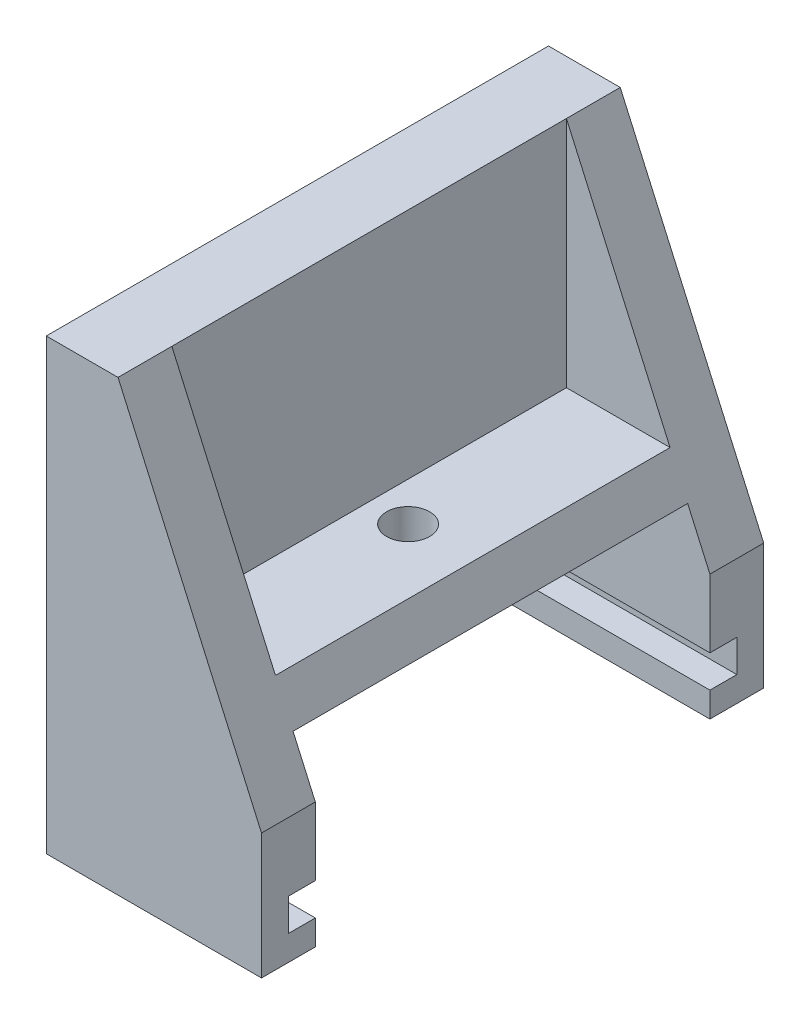
ISO-10303-21;
HEADER;
FILE_DESCRIPTION(('STEP AP214'),'2;1');
FILE_NAME('part.step','',(''),(''),'','','');
FILE_SCHEMA(('AUTOMOTIVE_DESIGN { 1 0 10303 214 1 1 1 1 }'));
ENDSEC;
DATA;
#1=APPLICATION_CONTEXT('core data for automotive mechanical design processes');
#2=APPLICATION_PROTOCOL_DEFINITION('international standard','automotive_design',2000,#1);
#3=PRODUCT_CONTEXT('',#1,'mechanical');
#4=PRODUCT('Part','Part','',(#3));
#5=PRODUCT_RELATED_PRODUCT_CATEGORY('part','',(#4));
#6=PRODUCT_DEFINITION_FORMATION('','',#4);
#7=PRODUCT_DEFINITION_CONTEXT('part definition',#1,'design');
#8=PRODUCT_DEFINITION('design','',#6,#7);
#9=PRODUCT_DEFINITION_SHAPE('','',#8);
#10=(LENGTH_UNIT() NAMED_UNIT(*) SI_UNIT(.MILLI.,.METRE.));
#11=(NAMED_UNIT(*) PLANE_ANGLE_UNIT() SI_UNIT($,.RADIAN.));
#12=(NAMED_UNIT(*) SI_UNIT($,.STERADIAN.) SOLID_ANGLE_UNIT());
#13=UNCERTAINTY_MEASURE_WITH_UNIT(LENGTH_MEASURE(1.E-05),#10,'distance_accuracy_value','');
#14=(GEOMETRIC_REPRESENTATION_CONTEXT(3) GLOBAL_UNCERTAINTY_ASSIGNED_CONTEXT((#13)) GLOBAL_UNIT_ASSIGNED_CONTEXT((#10,
#11,#12)) REPRESENTATION_CONTEXT('',''));
#15=CARTESIAN_POINT('',(0.,0.,0.));
#16=DIRECTION('',(0.,0.,1.));
#17=DIRECTION('',(1.,0.,0.));
#18=AXIS2_PLACEMENT_3D('',#15,#16,#17);
#19=CARTESIAN_POINT('',(12.,-25.,-28.));
#20=DIRECTION('',(1.,0.,0.));
#21=DIRECTION('',(0.,0.,-1.));
#22=AXIS2_PLACEMENT_3D('',#19,#20,#21);
#23=PLANE('',#22);
#24=DIRECTION('',(0.,-1.,0.));
#25=VECTOR('',#24,1.);
#26=CARTESIAN_POINT('',(12.,-25.,-26.5));
#27=LINE('',#26,#25);
#28=CARTESIAN_POINT('',(12.,-21.8,-26.5));
#29=VERTEX_POINT('',#28);
#30=CARTESIAN_POINT('',(12.,-23.6,-26.5));
#31=VERTEX_POINT('',#30);
#32=EDGE_CURVE('E357',#29,#31,#27,.T.);
#33=ORIENTED_EDGE('',*,*,#32,.T.);
#34=DIRECTION('',(0.,0.,1.));
#35=VECTOR('',#34,1.);
#36=CARTESIAN_POINT('',(12.,-23.6,-28.));
#37=LINE('',#36,#35);
#38=CARTESIAN_POINT('',(12.,-23.6,-25.));
#39=VERTEX_POINT('',#38);
#40=EDGE_CURVE('E360',#31,#39,#37,.T.);
#41=ORIENTED_EDGE('',*,*,#40,.T.);
#42=DIRECTION('',(0.,1.,0.));
#43=VECTOR('',#42,1.);
#44=CARTESIAN_POINT('',(12.,-25.,-25.));
#45=LINE('',#44,#43);
#46=CARTESIAN_POINT('',(12.,-25.,-25.));
#47=VERTEX_POINT('',#46);
#48=EDGE_CURVE('E278',#47,#39,#45,.T.);
#49=ORIENTED_EDGE('',*,*,#48,.F.);
#50=DIRECTION('',(0.,0.,1.));
#51=VECTOR('',#50,1.);
#52=CARTESIAN_POINT('',(12.,-25.,-28.));
#53=LINE('',#52,#51);
#54=CARTESIAN_POINT('',(12.,-25.,-28.));
#55=VERTEX_POINT('',#54);
#56=EDGE_CURVE('E220',#55,#47,#53,.T.);
#57=ORIENTED_EDGE('',*,*,#56,.F.);
#58=DIRECTION('',(0.,1.,0.));
#59=VECTOR('',#58,1.);
#60=CARTESIAN_POINT('',(12.,-25.,-28.));
#61=LINE('',#60,#59);
#62=CARTESIAN_POINT('',(12.,-18.,-28.));
#63=VERTEX_POINT('',#62);
#64=EDGE_CURVE('E292',#55,#63,#61,.T.);
#65=ORIENTED_EDGE('',*,*,#64,.T.);
#66=DIRECTION('',(0.,0.,1.));
#67=VECTOR('',#66,1.);
#68=CARTESIAN_POINT('',(12.,-18.,-28.));
#69=LINE('',#68,#67);
#70=CARTESIAN_POINT('',(12.,-18.,-25.));
#71=VERTEX_POINT('',#70);
#72=EDGE_CURVE('E212',#63,#71,#69,.T.);
#73=ORIENTED_EDGE('',*,*,#72,.T.);
#74=CARTESIAN_POINT('',(12.,-21.8,-25.));
#75=VERTEX_POINT('',#74);
#76=EDGE_CURVE('E277',#75,#71,#45,.T.);
#77=ORIENTED_EDGE('',*,*,#76,.F.);
#78=DIRECTION('',(0.,0.,-1.));
#79=VECTOR('',#78,1.);
#80=CARTESIAN_POINT('',(12.,-21.8,-28.));
#81=LINE('',#80,#79);
#82=EDGE_CURVE('E56',#75,#29,#81,.T.);
#83=ORIENTED_EDGE('',*,*,#82,.T.);
#84=EDGE_LOOP('',(#33,#41,#49,#57,#65,#73,#77,#83));
#85=FACE_BOUND('',#84,.T.);
#86=ADVANCED_FACE('F33',(#85),#23,.T.);
#87=CARTESIAN_POINT('',(0.,0.,-28.));
#88=DIRECTION('',(-1.,0.,0.));
#89=DIRECTION('',(0.,0.,1.));
#90=AXIS2_PLACEMENT_3D('',#87,#88,#89);
#91=PLANE('',#90);
#92=DIRECTION('',(0.,-1.,0.));
#93=VECTOR('',#92,1.);
#94=CARTESIAN_POINT('',(0.,-15.2079971845944,-25.));
#95=LINE('',#94,#93);
#96=CARTESIAN_POINT('',(0.,-23.6,-25.));
#97=VERTEX_POINT('',#96);
#98=CARTESIAN_POINT('',(0.,-25.,-25.));
#99=VERTEX_POINT('',#98);
#100=EDGE_CURVE('E254',#97,#99,#95,.T.);
#101=ORIENTED_EDGE('',*,*,#100,.F.);
#102=DIRECTION('',(0.,0.,-1.));
#103=VECTOR('',#102,1.);
#104=CARTESIAN_POINT('',(0.,-23.6,-25.));
#105=LINE('',#104,#103);
#106=CARTESIAN_POINT('',(0.,-23.6,-26.5));
#107=VERTEX_POINT('',#106);
#108=EDGE_CURVE('E367',#97,#107,#105,.T.);
#109=ORIENTED_EDGE('',*,*,#108,.T.);
#110=DIRECTION('',(0.,1.,0.));
#111=VECTOR('',#110,1.);
#112=CARTESIAN_POINT('',(0.,-21.8,-26.5));
#113=LINE('',#112,#111);
#114=CARTESIAN_POINT('',(0.,-21.8,-26.5));
#115=VERTEX_POINT('',#114);
#116=EDGE_CURVE('E246',#107,#115,#113,.T.);
#117=ORIENTED_EDGE('',*,*,#116,.T.);
#118=DIRECTION('',(0.,0.,1.));
#119=VECTOR('',#118,1.);
#120=CARTESIAN_POINT('',(0.,-21.8,-25.));
#121=LINE('',#120,#119);
#122=CARTESIAN_POINT('',(0.,-21.8,-25.));
#123=VERTEX_POINT('',#122);
#124=EDGE_CURVE('E233',#115,#123,#121,.T.);
#125=ORIENTED_EDGE('',*,*,#124,.T.);
#126=CARTESIAN_POINT('',(0.,-15.2079971845944,-25.));
#127=VERTEX_POINT('',#126);
#128=EDGE_CURVE('E243',#127,#123,#95,.T.);
#129=ORIENTED_EDGE('',*,*,#128,.F.);
#130=DIRECTION('',(0.,0.,1.));
#131=VECTOR('',#130,1.);
#132=CARTESIAN_POINT('',(0.,-15.2079971845944,-25.));
#133=LINE('',#132,#131);
#134=CARTESIAN_POINT('',(0.,-15.2079971845944,-3.));
#135=VERTEX_POINT('',#134);
#136=EDGE_CURVE('E257',#127,#135,#133,.T.);
#137=ORIENTED_EDGE('',*,*,#136,.T.);
#138=DIRECTION('',(0.,-1.,0.));
#139=VECTOR('',#138,1.);
#140=CARTESIAN_POINT('',(0.,-15.2079971845944,-3.));
#141=LINE('',#140,#139);
#142=CARTESIAN_POINT('',(0.,-21.8,-3.));
#143=VERTEX_POINT('',#142);
#144=EDGE_CURVE('E336',#135,#143,#141,.T.);
#145=ORIENTED_EDGE('',*,*,#144,.T.);
#146=DIRECTION('',(0.,0.,-1.));
#147=VECTOR('',#146,1.);
#148=CARTESIAN_POINT('',(0.,-21.8,-3.));
#149=LINE('',#148,#147);
#150=CARTESIAN_POINT('',(0.,-21.8,-1.5));
#151=VERTEX_POINT('',#150);
#152=EDGE_CURVE('E348',#151,#143,#149,.T.);
#153=ORIENTED_EDGE('',*,*,#152,.F.);
#154=DIRECTION('',(0.,1.,0.));
#155=VECTOR('',#154,1.);
#156=CARTESIAN_POINT('',(0.,-21.8,-1.5));
#157=LINE('',#156,#155);
#158=CARTESIAN_POINT('',(0.,-23.6,-1.5));
#159=VERTEX_POINT('',#158);
#160=EDGE_CURVE('E351',#159,#151,#157,.T.);
#161=ORIENTED_EDGE('',*,*,#160,.F.);
#162=DIRECTION('',(0.,0.,1.));
#163=VECTOR('',#162,1.);
#164=CARTESIAN_POINT('',(0.,-23.6,-3.));
#165=LINE('',#164,#163);
#166=CARTESIAN_POINT('',(0.,-23.6,-3.));
#167=VERTEX_POINT('',#166);
#168=EDGE_CURVE('E354',#167,#159,#165,.T.);
#169=ORIENTED_EDGE('',*,*,#168,.F.);
#170=CARTESIAN_POINT('',(0.,-25.,-3.));
#171=VERTEX_POINT('',#170);
#172=EDGE_CURVE('E337',#167,#171,#141,.T.);
#173=ORIENTED_EDGE('',*,*,#172,.T.);
#174=DIRECTION('',(0.,0.,1.));
#175=VECTOR('',#174,1.);
#176=CARTESIAN_POINT('',(0.,-25.,-28.));
#177=LINE('',#176,#175);
#178=CARTESIAN_POINT('',(0.,-25.,0.));
#179=VERTEX_POINT('',#178);
#180=EDGE_CURVE('E227',#171,#179,#177,.T.);
#181=ORIENTED_EDGE('',*,*,#180,.T.);
#182=DIRECTION('',(0.,-1.,0.));
#183=VECTOR('',#182,1.);
#184=CARTESIAN_POINT('',(0.,0.,0.));
#185=LINE('',#184,#183);
#186=CARTESIAN_POINT('',(0.,0.,0.));
#187=VERTEX_POINT('',#186);
#188=EDGE_CURVE('E298',#187,#179,#185,.T.);
#189=ORIENTED_EDGE('',*,*,#188,.F.);
#190=DIRECTION('',(0.,0.,1.));
#191=VECTOR('',#190,1.);
#192=CARTESIAN_POINT('',(0.,0.,-28.));
#193=LINE('',#192,#191);
#194=CARTESIAN_POINT('',(0.,0.,-28.));
#195=VERTEX_POINT('',#194);
#196=EDGE_CURVE('E228',#195,#187,#193,.T.);
#197=ORIENTED_EDGE('',*,*,#196,.F.);
#198=DIRECTION('',(0.,-1.,0.));
#199=VECTOR('',#198,1.);
#200=CARTESIAN_POINT('',(0.,0.,-28.));
#201=LINE('',#200,#199);
#202=CARTESIAN_POINT('',(0.,-25.,-28.));
#203=VERTEX_POINT('',#202);
#204=EDGE_CURVE('E286',#195,#203,#201,.T.);
#205=ORIENTED_EDGE('',*,*,#204,.T.);
#206=EDGE_CURVE('E224',#203,#99,#177,.T.);
#207=ORIENTED_EDGE('',*,*,#206,.T.);
#208=EDGE_LOOP('',(#101,#109,#117,#125,#129,#137,#145,#153,#161,#169,#173,#181,#189,#197,#205,#207));
#209=FACE_BOUND('',#208,.T.);
#210=ADVANCED_FACE('F241',(#209),#91,.T.);
#211=CARTESIAN_POINT('',(15.,-15.2079971845944,-25.));
#212=DIRECTION('',(0.,0.,-1.));
#213=DIRECTION('',(0.,1.,0.));
#214=AXIS2_PLACEMENT_3D('',#211,#212,#213);
#215=PLANE('',#214);
#216=DIRECTION('',(1.,0.,0.));
#217=VECTOR('',#216,1.);
#218=CARTESIAN_POINT('',(15.,-23.6,-25.));
#219=LINE('',#218,#217);
#220=EDGE_CURVE('E11',#97,#39,#219,.T.);
#221=ORIENTED_EDGE('',*,*,#220,.F.);
#222=ORIENTED_EDGE('',*,*,#100,.T.);
#223=DIRECTION('',(1.,0.,0.));
#224=VECTOR('',#223,1.);
#225=CARTESIAN_POINT('',(0.,-25.,-25.));
#226=LINE('',#225,#224);
#227=EDGE_CURVE('E275',#99,#47,#226,.T.);
#228=ORIENTED_EDGE('',*,*,#227,.T.);
#229=ORIENTED_EDGE('',*,*,#48,.T.);
#230=EDGE_LOOP('',(#221,#222,#228,#229));
#231=FACE_BOUND('',#230,.T.);
#232=ADVANCED_FACE('F407',(#231),#215,.F.);
#233=DIRECTION('',(-1.,0.,0.));
#234=VECTOR('',#233,1.);
#235=CARTESIAN_POINT('',(15.,-21.8,-25.));
#236=LINE('',#235,#234);
#237=EDGE_CURVE('E41',#75,#123,#236,.T.);
#238=ORIENTED_EDGE('',*,*,#237,.F.);
#239=ORIENTED_EDGE('',*,*,#76,.T.);
#240=DIRECTION('',(-0.406138466053448,0.913811548620257,0.));
#241=VECTOR('',#240,1.);
#242=CARTESIAN_POINT('',(12.,-18.,-25.));
#243=LINE('',#242,#241);
#244=CARTESIAN_POINT('',(10.7591098598198,-15.2079971845944,-25.));
#245=VERTEX_POINT('',#244);
#246=EDGE_CURVE('E281',#71,#245,#243,.T.);
#247=ORIENTED_EDGE('',*,*,#246,.T.);
#248=DIRECTION('',(-1.,0.,0.));
#249=VECTOR('',#248,1.);
#250=CARTESIAN_POINT('',(15.,-15.2079971845944,-25.));
#251=LINE('',#250,#249);
#252=EDGE_CURVE('E251',#245,#127,#251,.T.);
#253=ORIENTED_EDGE('',*,*,#252,.T.);
#254=ORIENTED_EDGE('',*,*,#128,.T.);
#255=EDGE_LOOP('',(#238,#239,#247,#253,#254));
#256=FACE_BOUND('',#255,.T.);
#257=ADVANCED_FACE('F249',(#256),#215,.F.);
#258=CARTESIAN_POINT('',(15.,-15.2079971845944,-3.));
#259=DIRECTION('',(0.,0.,-1.));
#260=DIRECTION('',(-1.,0.,0.));
#261=AXIS2_PLACEMENT_3D('',#258,#259,#260);
#262=PLANE('',#261);
#263=DIRECTION('',(1.,0.,0.));
#264=VECTOR('',#263,1.);
#265=CARTESIAN_POINT('',(15.,-21.8,-3.));
#266=LINE('',#265,#264);
#267=CARTESIAN_POINT('',(12.,-21.8,-3.));
#268=VERTEX_POINT('',#267);
#269=EDGE_CURVE('E210',#143,#268,#266,.T.);
#270=ORIENTED_EDGE('',*,*,#269,.F.);
#271=ORIENTED_EDGE('',*,*,#144,.F.);
#272=DIRECTION('',(-1.,0.,0.));
#273=VECTOR('',#272,1.);
#274=CARTESIAN_POINT('',(15.,-15.2079971845944,-3.));
#275=LINE('',#274,#273);
#276=CARTESIAN_POINT('',(10.7591098598198,-15.2079971845944,-3.));
#277=VERTEX_POINT('',#276);
#278=EDGE_CURVE('E253',#277,#135,#275,.T.);
#279=ORIENTED_EDGE('',*,*,#278,.F.);
#280=DIRECTION('',(-0.406138466053448,0.913811548620257,0.));
#281=VECTOR('',#280,1.);
#282=CARTESIAN_POINT('',(12.,-18.,-3.));
#283=LINE('',#282,#281);
#284=CARTESIAN_POINT('',(12.,-18.,-3.));
#285=VERTEX_POINT('',#284);
#286=EDGE_CURVE('E269',#285,#277,#283,.T.);
#287=ORIENTED_EDGE('',*,*,#286,.F.);
#288=DIRECTION('',(0.,1.,0.));
#289=VECTOR('',#288,1.);
#290=CARTESIAN_POINT('',(12.,-25.,-3.));
#291=LINE('',#290,#289);
#292=EDGE_CURVE('E265',#268,#285,#291,.T.);
#293=ORIENTED_EDGE('',*,*,#292,.F.);
#294=EDGE_LOOP('',(#270,#271,#279,#287,#293));
#295=FACE_BOUND('',#294,.T.);
#296=ADVANCED_FACE('F330',(#295),#262,.T.);
#297=DIRECTION('',(0.,0.,1.));
#298=VECTOR('',#297,1.);
#299=CARTESIAN_POINT('',(12.,-21.8,-28.));
#300=LINE('',#299,#298);
#301=CARTESIAN_POINT('',(12.,-21.8,-1.5));
#302=VERTEX_POINT('',#301);
#303=EDGE_CURVE('E326',#268,#302,#300,.T.);
#304=ORIENTED_EDGE('',*,*,#303,.F.);
#305=ORIENTED_EDGE('',*,*,#292,.T.);
#306=CARTESIAN_POINT('',(12.,-18.,0.));
#307=VERTEX_POINT('',#306);
#308=EDGE_CURVE('E219',#285,#307,#69,.T.);
#309=ORIENTED_EDGE('',*,*,#308,.T.);
#310=DIRECTION('',(0.,1.,0.));
#311=VECTOR('',#310,1.);
#312=CARTESIAN_POINT('',(12.,-25.,0.));
#313=LINE('',#312,#311);
#314=CARTESIAN_POINT('',(12.,-25.,0.));
#315=VERTEX_POINT('',#314);
#316=EDGE_CURVE('E303',#315,#307,#313,.T.);
#317=ORIENTED_EDGE('',*,*,#316,.F.);
#318=CARTESIAN_POINT('',(12.,-25.,-3.));
#319=VERTEX_POINT('',#318);
#320=EDGE_CURVE('E223',#319,#315,#53,.T.);
#321=ORIENTED_EDGE('',*,*,#320,.F.);
#322=CARTESIAN_POINT('',(12.,-23.6,-3.));
#323=VERTEX_POINT('',#322);
#324=EDGE_CURVE('E266',#319,#323,#291,.T.);
#325=ORIENTED_EDGE('',*,*,#324,.T.);
#326=DIRECTION('',(0.,0.,-1.));
#327=VECTOR('',#326,1.);
#328=CARTESIAN_POINT('',(12.,-23.6,-28.));
#329=LINE('',#328,#327);
#330=CARTESIAN_POINT('',(12.,-23.6,-1.5));
#331=VERTEX_POINT('',#330);
#332=EDGE_CURVE('E343',#331,#323,#329,.T.);
#333=ORIENTED_EDGE('',*,*,#332,.F.);
#334=DIRECTION('',(0.,-1.,0.));
#335=VECTOR('',#334,1.);
#336=CARTESIAN_POINT('',(12.,-25.,-1.5));
#337=LINE('',#336,#335);
#338=EDGE_CURVE('E339',#302,#331,#337,.T.);
#339=ORIENTED_EDGE('',*,*,#338,.F.);
#340=EDGE_LOOP('',(#304,#305,#309,#317,#321,#325,#333,#339));
#341=FACE_BOUND('',#340,.T.);
#342=ADVANCED_FACE('F322',(#341),#23,.T.);
#343=CARTESIAN_POINT('',(0.,-25.,-28.));
#344=DIRECTION('',(0.,-1.,0.));
#345=DIRECTION('',(0.,0.,-1.));
#346=AXIS2_PLACEMENT_3D('',#343,#344,#345);
#347=PLANE('',#346);
#348=ORIENTED_EDGE('',*,*,#180,.F.);
#349=DIRECTION('',(1.,0.,0.));
#350=VECTOR('',#349,1.);
#351=CARTESIAN_POINT('',(0.,-25.,-3.));
#352=LINE('',#351,#350);
#353=EDGE_CURVE('E261',#171,#319,#352,.T.);
#354=ORIENTED_EDGE('',*,*,#353,.T.);
#355=ORIENTED_EDGE('',*,*,#320,.T.);
#356=DIRECTION('',(1.,0.,0.));
#357=VECTOR('',#356,1.);
#358=CARTESIAN_POINT('',(0.,-25.,0.));
#359=LINE('',#358,#357);
#360=EDGE_CURVE('E301',#179,#315,#359,.T.);
#361=ORIENTED_EDGE('',*,*,#360,.F.);
#362=EDGE_LOOP('',(#348,#354,#355,#361));
#363=FACE_BOUND('',#362,.T.);
#364=ADVANCED_FACE('F317',(#363),#347,.T.);
#365=CARTESIAN_POINT('',(4.,0.,-28.));
#366=DIRECTION('',(0.,1.,0.));
#367=DIRECTION('',(-1.,0.,0.));
#368=AXIS2_PLACEMENT_3D('',#365,#366,#367);
#369=PLANE('',#368);
#370=DIRECTION('',(-1.,0.,0.));
#371=VECTOR('',#370,1.);
#372=CARTESIAN_POINT('',(4.,0.,0.));
#373=LINE('',#372,#371);
#374=CARTESIAN_POINT('',(4.,0.,0.));
#375=VERTEX_POINT('',#374);
#376=EDGE_CURVE('E283',#375,#187,#373,.T.);
#377=ORIENTED_EDGE('',*,*,#376,.F.);
#378=DIRECTION('',(0.,0.,1.));
#379=VECTOR('',#378,1.);
#380=CARTESIAN_POINT('',(4.,0.,-28.));
#381=LINE('',#380,#379);
#382=CARTESIAN_POINT('',(4.,0.,-3.));
#383=VERTEX_POINT('',#382);
#384=EDGE_CURVE('E202',#383,#375,#381,.T.);
#385=ORIENTED_EDGE('',*,*,#384,.F.);
#386=DIRECTION('',(0.,0.,1.));
#387=VECTOR('',#386,1.);
#388=CARTESIAN_POINT('',(4.,0.,-25.));
#389=LINE('',#388,#387);
#390=CARTESIAN_POINT('',(4.,0.,-25.));
#391=VERTEX_POINT('',#390);
#392=EDGE_CURVE('E180',#391,#383,#389,.T.);
#393=ORIENTED_EDGE('',*,*,#392,.F.);
#394=CARTESIAN_POINT('',(4.,0.,-28.));
#395=VERTEX_POINT('',#394);
#396=EDGE_CURVE('E200',#395,#391,#381,.T.);
#397=ORIENTED_EDGE('',*,*,#396,.F.);
#398=DIRECTION('',(-1.,0.,0.));
#399=VECTOR('',#398,1.);
#400=CARTESIAN_POINT('',(4.,0.,-28.));
#401=LINE('',#400,#399);
#402=EDGE_CURVE('E284',#395,#195,#401,.T.);
#403=ORIENTED_EDGE('',*,*,#402,.T.);
#404=ORIENTED_EDGE('',*,*,#196,.T.);
#405=EDGE_LOOP('',(#377,#385,#393,#397,#403,#404));
#406=FACE_BOUND('',#405,.T.);
#407=ADVANCED_FACE('F35',(#406),#369,.T.);
#408=CARTESIAN_POINT('',(12.,-18.,-28.));
#409=DIRECTION('',(0.913811548620257,0.406138466053448,0.));
#410=DIRECTION('',(-0.406138466053448,0.913811548620257,0.));
#411=AXIS2_PLACEMENT_3D('',#408,#409,#410);
#412=PLANE('',#411);
#413=DIRECTION('',(-0.406138466053448,0.913811548620257,0.));
#414=VECTOR('',#413,1.);
#415=CARTESIAN_POINT('',(9.77777777777778,-13.,-25.));
#416=LINE('',#415,#414);
#417=CARTESIAN_POINT('',(9.77777777777778,-13.,-25.));
#418=VERTEX_POINT('',#417);
#419=EDGE_CURVE('E187',#418,#391,#416,.T.);
#420=ORIENTED_EDGE('',*,*,#419,.F.);
#421=DIRECTION('',(0.,0.,1.));
#422=VECTOR('',#421,1.);
#423=CARTESIAN_POINT('',(9.77777777777778,-13.,-25.));
#424=LINE('',#423,#422);
#425=CARTESIAN_POINT('',(9.77777777777778,-13.,-3.));
#426=VERTEX_POINT('',#425);
#427=EDGE_CURVE('E247',#418,#426,#424,.T.);
#428=ORIENTED_EDGE('',*,*,#427,.T.);
#429=DIRECTION('',(-0.406138466053448,0.913811548620257,0.));
#430=VECTOR('',#429,1.);
#431=CARTESIAN_POINT('',(9.77777777777778,-13.,-3.));
#432=LINE('',#431,#430);
#433=EDGE_CURVE('E311',#426,#383,#432,.T.);
#434=ORIENTED_EDGE('',*,*,#433,.T.);
#435=ORIENTED_EDGE('',*,*,#384,.T.);
#436=DIRECTION('',(-0.406138466053448,0.913811548620257,0.));
#437=VECTOR('',#436,1.);
#438=CARTESIAN_POINT('',(12.,-18.,0.));
#439=LINE('',#438,#437);
#440=EDGE_CURVE('E215',#307,#375,#439,.T.);
#441=ORIENTED_EDGE('',*,*,#440,.F.);
#442=ORIENTED_EDGE('',*,*,#308,.F.);
#443=ORIENTED_EDGE('',*,*,#286,.T.);
#444=DIRECTION('',(0.,0.,-1.));
#445=VECTOR('',#444,1.);
#446=CARTESIAN_POINT('',(10.7591098598198,-15.2079971845944,-28.));
#447=LINE('',#446,#445);
#448=EDGE_CURVE('E272',#277,#245,#447,.T.);
#449=ORIENTED_EDGE('',*,*,#448,.T.);
#450=ORIENTED_EDGE('',*,*,#246,.F.);
#451=ORIENTED_EDGE('',*,*,#72,.F.);
#452=DIRECTION('',(-0.406138466053448,0.913811548620257,0.));
#453=VECTOR('',#452,1.);
#454=CARTESIAN_POINT('',(12.,-18.,-28.));
#455=LINE('',#454,#453);
#456=EDGE_CURVE('E207',#63,#395,#455,.T.);
#457=ORIENTED_EDGE('',*,*,#456,.T.);
#458=ORIENTED_EDGE('',*,*,#396,.T.);
#459=EDGE_LOOP('',(#420,#428,#434,#435,#441,#442,#443,#449,#450,#451,#457,#458));
#460=FACE_BOUND('',#459,.T.);
#461=ADVANCED_FACE('F205',(#460),#412,.T.);
#462=ORIENTED_EDGE('',*,*,#227,.F.);
#463=ORIENTED_EDGE('',*,*,#206,.F.);
#464=DIRECTION('',(1.,0.,0.));
#465=VECTOR('',#464,1.);
#466=CARTESIAN_POINT('',(0.,-25.,-28.));
#467=LINE('',#466,#465);
#468=EDGE_CURVE('E289',#203,#55,#467,.T.);
#469=ORIENTED_EDGE('',*,*,#468,.T.);
#470=ORIENTED_EDGE('',*,*,#56,.T.);
#471=EDGE_LOOP('',(#462,#463,#469,#470));
#472=FACE_BOUND('',#471,.T.);
#473=ADVANCED_FACE('F415',(#472),#347,.T.);
#474=CARTESIAN_POINT('',(0.,0.,-28.));
#475=DIRECTION('',(0.,0.,1.));
#476=DIRECTION('',(1.,0.,0.));
#477=AXIS2_PLACEMENT_3D('',#474,#475,#476);
#478=PLANE('',#477);
#479=ORIENTED_EDGE('',*,*,#402,.F.);
#480=ORIENTED_EDGE('',*,*,#456,.F.);
#481=ORIENTED_EDGE('',*,*,#64,.F.);
#482=ORIENTED_EDGE('',*,*,#468,.F.);
#483=ORIENTED_EDGE('',*,*,#204,.F.);
#484=EDGE_LOOP('',(#479,#480,#481,#482,#483));
#485=FACE_BOUND('',#484,.T.);
#486=ADVANCED_FACE('F465',(#485),#478,.F.);
#487=CARTESIAN_POINT('',(0.,0.,0.));
#488=DIRECTION('',(0.,0.,1.));
#489=DIRECTION('',(1.,0.,0.));
#490=AXIS2_PLACEMENT_3D('',#487,#488,#489);
#491=PLANE('',#490);
#492=ORIENTED_EDGE('',*,*,#376,.T.);
#493=ORIENTED_EDGE('',*,*,#188,.T.);
#494=ORIENTED_EDGE('',*,*,#360,.T.);
#495=ORIENTED_EDGE('',*,*,#316,.T.);
#496=ORIENTED_EDGE('',*,*,#440,.T.);
#497=EDGE_LOOP('',(#492,#493,#494,#495,#496));
#498=FACE_BOUND('',#497,.T.);
#499=ADVANCED_FACE('F309',(#498),#491,.T.);
#500=CARTESIAN_POINT('',(15.,-15.2079971845944,-25.));
#501=DIRECTION('',(0.,-1.,0.));
#502=DIRECTION('',(0.,0.,-1.));
#503=AXIS2_PLACEMENT_3D('',#500,#501,#502);
#504=PLANE('',#503);
#505=CARTESIAN_POINT('',(6.17275319657275,-15.2079971845944,-14.));
#506=DIRECTION('',(0.,-1.,0.));
#507=DIRECTION('',(0.,0.,-1.));
#508=AXIS2_PLACEMENT_3D('',#505,#506,#507);
#509=CIRCLE('',#508,1.2);
#510=CARTESIAN_POINT('',(6.17275319657275,-15.2079971845944,-15.2));
#511=VERTEX_POINT('',#510);
#512=EDGE_CURVE('E377',#511,#511,#509,.T.);
#513=ORIENTED_EDGE('',*,*,#512,.F.);
#514=EDGE_LOOP('',(#513));
#515=FACE_BOUND('',#514,.T.);
#516=ORIENTED_EDGE('',*,*,#278,.T.);
#517=ORIENTED_EDGE('',*,*,#136,.F.);
#518=ORIENTED_EDGE('',*,*,#252,.F.);
#519=ORIENTED_EDGE('',*,*,#448,.F.);
#520=EDGE_LOOP('',(#516,#517,#518,#519));
#521=FACE_BOUND('',#520,.T.);
#522=ADVANCED_FACE('F334',(#515,#521),#504,.T.);
#523=DIRECTION('',(-1.,0.,0.));
#524=VECTOR('',#523,1.);
#525=CARTESIAN_POINT('',(15.,-23.6,-3.));
#526=LINE('',#525,#524);
#527=EDGE_CURVE('E208',#323,#167,#526,.T.);
#528=ORIENTED_EDGE('',*,*,#527,.F.);
#529=ORIENTED_EDGE('',*,*,#324,.F.);
#530=ORIENTED_EDGE('',*,*,#353,.F.);
#531=ORIENTED_EDGE('',*,*,#172,.F.);
#532=EDGE_LOOP('',(#528,#529,#530,#531));
#533=FACE_BOUND('',#532,.T.);
#534=ADVANCED_FACE('F417',(#533),#262,.T.);
#535=CARTESIAN_POINT('',(15.,-21.8,-3.));
#536=DIRECTION('',(0.,1.,0.));
#537=DIRECTION('',(0.,0.,1.));
#538=AXIS2_PLACEMENT_3D('',#535,#536,#537);
#539=PLANE('',#538);
#540=ORIENTED_EDGE('',*,*,#303,.T.);
#541=DIRECTION('',(-1.,0.,0.));
#542=VECTOR('',#541,1.);
#543=CARTESIAN_POINT('',(15.,-21.8,-1.5));
#544=LINE('',#543,#542);
#545=EDGE_CURVE('E345',#302,#151,#544,.T.);
#546=ORIENTED_EDGE('',*,*,#545,.T.);
#547=ORIENTED_EDGE('',*,*,#152,.T.);
#548=ORIENTED_EDGE('',*,*,#269,.T.);
#549=EDGE_LOOP('',(#540,#546,#547,#548));
#550=FACE_BOUND('',#549,.T.);
#551=ADVANCED_FACE('F425',(#550),#539,.F.);
#552=CARTESIAN_POINT('',(15.,-21.8,-1.5));
#553=DIRECTION('',(0.,0.,1.));
#554=DIRECTION('',(0.,-1.,0.));
#555=AXIS2_PLACEMENT_3D('',#552,#553,#554);
#556=PLANE('',#555);
#557=ORIENTED_EDGE('',*,*,#338,.T.);
#558=DIRECTION('',(-1.,0.,0.));
#559=VECTOR('',#558,1.);
#560=CARTESIAN_POINT('',(15.,-23.6,-1.5));
#561=LINE('',#560,#559);
#562=EDGE_CURVE('E346',#331,#159,#561,.T.);
#563=ORIENTED_EDGE('',*,*,#562,.T.);
#564=ORIENTED_EDGE('',*,*,#160,.T.);
#565=ORIENTED_EDGE('',*,*,#545,.F.);
#566=EDGE_LOOP('',(#557,#563,#564,#565));
#567=FACE_BOUND('',#566,.T.);
#568=ADVANCED_FACE('F431',(#567),#556,.F.);
#569=CARTESIAN_POINT('',(15.,-23.6,-3.));
#570=DIRECTION('',(0.,-1.,0.));
#571=DIRECTION('',(0.,0.,-1.));
#572=AXIS2_PLACEMENT_3D('',#569,#570,#571);
#573=PLANE('',#572);
#574=ORIENTED_EDGE('',*,*,#332,.T.);
#575=ORIENTED_EDGE('',*,*,#527,.T.);
#576=ORIENTED_EDGE('',*,*,#168,.T.);
#577=ORIENTED_EDGE('',*,*,#562,.F.);
#578=EDGE_LOOP('',(#574,#575,#576,#577));
#579=FACE_BOUND('',#578,.T.);
#580=ADVANCED_FACE('F441',(#579),#573,.F.);
#581=CARTESIAN_POINT('',(15.,-23.6,-25.));
#582=DIRECTION('',(0.,1.,0.));
#583=DIRECTION('',(0.,0.,1.));
#584=AXIS2_PLACEMENT_3D('',#581,#582,#583);
#585=PLANE('',#584);
#586=DIRECTION('',(-1.,0.,0.));
#587=VECTOR('',#586,1.);
#588=CARTESIAN_POINT('',(15.,-23.6,-26.5));
#589=LINE('',#588,#587);
#590=EDGE_CURVE('E364',#31,#107,#589,.T.);
#591=ORIENTED_EDGE('',*,*,#590,.T.);
#592=ORIENTED_EDGE('',*,*,#108,.F.);
#593=ORIENTED_EDGE('',*,*,#220,.T.);
#594=ORIENTED_EDGE('',*,*,#40,.F.);
#595=EDGE_LOOP('',(#591,#592,#593,#594));
#596=FACE_BOUND('',#595,.T.);
#597=ADVANCED_FACE('F450',(#596),#585,.T.);
#598=CARTESIAN_POINT('',(15.,-21.8,-26.5));
#599=DIRECTION('',(0.,0.,1.));
#600=DIRECTION('',(0.,-1.,0.));
#601=AXIS2_PLACEMENT_3D('',#598,#599,#600);
#602=PLANE('',#601);
#603=DIRECTION('',(-1.,0.,0.));
#604=VECTOR('',#603,1.);
#605=CARTESIAN_POINT('',(15.,-21.8,-26.5));
#606=LINE('',#605,#604);
#607=EDGE_CURVE('E365',#29,#115,#606,.T.);
#608=ORIENTED_EDGE('',*,*,#607,.T.);
#609=ORIENTED_EDGE('',*,*,#116,.F.);
#610=ORIENTED_EDGE('',*,*,#590,.F.);
#611=ORIENTED_EDGE('',*,*,#32,.F.);
#612=EDGE_LOOP('',(#608,#609,#610,#611));
#613=FACE_BOUND('',#612,.T.);
#614=ADVANCED_FACE('F468',(#613),#602,.T.);
#615=CARTESIAN_POINT('',(15.,-21.8,-25.));
#616=DIRECTION('',(0.,-1.,0.));
#617=DIRECTION('',(0.,0.,-1.));
#618=AXIS2_PLACEMENT_3D('',#615,#616,#617);
#619=PLANE('',#618);
#620=ORIENTED_EDGE('',*,*,#237,.T.);
#621=ORIENTED_EDGE('',*,*,#124,.F.);
#622=ORIENTED_EDGE('',*,*,#607,.F.);
#623=ORIENTED_EDGE('',*,*,#82,.F.);
#624=EDGE_LOOP('',(#620,#621,#622,#623));
#625=FACE_BOUND('',#624,.T.);
#626=ADVANCED_FACE('F232',(#625),#619,.T.);
#627=CARTESIAN_POINT('',(4.,-13.,-25.));
#628=DIRECTION('',(0.,-1.,0.));
#629=DIRECTION('',(0.,0.,-1.));
#630=AXIS2_PLACEMENT_3D('',#627,#628,#629);
#631=PLANE('',#630);
#632=CARTESIAN_POINT('',(6.17275319657275,-13.,-14.));
#633=DIRECTION('',(0.,1.,0.));
#634=DIRECTION('',(0.,0.,1.));
#635=AXIS2_PLACEMENT_3D('',#632,#633,#634);
#636=CIRCLE('',#635,1.2);
#637=CARTESIAN_POINT('',(6.17275319657275,-13.,-12.8));
#638=VERTEX_POINT('',#637);
#639=EDGE_CURVE('E381',#638,#638,#636,.T.);
#640=ORIENTED_EDGE('',*,*,#639,.F.);
#641=EDGE_LOOP('',(#640));
#642=FACE_BOUND('',#641,.T.);
#643=DIRECTION('',(1.,0.,0.));
#644=VECTOR('',#643,1.);
#645=CARTESIAN_POINT('',(4.,-13.,-3.));
#646=LINE('',#645,#644);
#647=CARTESIAN_POINT('',(4.,-13.,-3.));
#648=VERTEX_POINT('',#647);
#649=EDGE_CURVE('E194',#648,#426,#646,.T.);
#650=ORIENTED_EDGE('',*,*,#649,.T.);
#651=ORIENTED_EDGE('',*,*,#427,.F.);
#652=DIRECTION('',(1.,0.,0.));
#653=VECTOR('',#652,1.);
#654=CARTESIAN_POINT('',(4.,-13.,-25.));
#655=LINE('',#654,#653);
#656=CARTESIAN_POINT('',(4.,-13.,-25.));
#657=VERTEX_POINT('',#656);
#658=EDGE_CURVE('E186',#657,#418,#655,.T.);
#659=ORIENTED_EDGE('',*,*,#658,.F.);
#660=DIRECTION('',(0.,0.,1.));
#661=VECTOR('',#660,1.);
#662=CARTESIAN_POINT('',(4.,-13.,-25.));
#663=LINE('',#662,#661);
#664=EDGE_CURVE('E182',#657,#648,#663,.T.);
#665=ORIENTED_EDGE('',*,*,#664,.T.);
#666=EDGE_LOOP('',(#650,#651,#659,#665));
#667=FACE_BOUND('',#666,.T.);
#668=ADVANCED_FACE('F387',(#642,#667),#631,.F.);
#669=CARTESIAN_POINT('',(4.,0.,-25.));
#670=DIRECTION('',(-1.,0.,0.));
#671=DIRECTION('',(0.,-1.,0.));
#672=AXIS2_PLACEMENT_3D('',#669,#670,#671);
#673=PLANE('',#672);
#674=DIRECTION('',(0.,-1.,0.));
#675=VECTOR('',#674,1.);
#676=CARTESIAN_POINT('',(4.,0.,-3.));
#677=LINE('',#676,#675);
#678=EDGE_CURVE('E48',#383,#648,#677,.T.);
#679=ORIENTED_EDGE('',*,*,#678,.T.);
#680=ORIENTED_EDGE('',*,*,#664,.F.);
#681=DIRECTION('',(0.,-1.,0.));
#682=VECTOR('',#681,1.);
#683=CARTESIAN_POINT('',(4.,0.,-25.));
#684=LINE('',#683,#682);
#685=EDGE_CURVE('E176',#391,#657,#684,.T.);
#686=ORIENTED_EDGE('',*,*,#685,.F.);
#687=ORIENTED_EDGE('',*,*,#392,.T.);
#688=EDGE_LOOP('',(#679,#680,#686,#687));
#689=FACE_BOUND('',#688,.T.);
#690=ADVANCED_FACE('F178',(#689),#673,.F.);
#691=CARTESIAN_POINT('',(0.,0.,-25.));
#692=DIRECTION('',(0.,0.,-1.));
#693=DIRECTION('',(-1.,0.,0.));
#694=AXIS2_PLACEMENT_3D('',#691,#692,#693);
#695=PLANE('',#694);
#696=ORIENTED_EDGE('',*,*,#419,.T.);
#697=ORIENTED_EDGE('',*,*,#685,.T.);
#698=ORIENTED_EDGE('',*,*,#658,.T.);
#699=EDGE_LOOP('',(#696,#697,#698));
#700=FACE_BOUND('',#699,.T.);
#701=ADVANCED_FACE('F190',(#700),#695,.F.);
#702=CARTESIAN_POINT('',(0.,0.,-3.));
#703=DIRECTION('',(0.,0.,-1.));
#704=DIRECTION('',(-1.,0.,0.));
#705=AXIS2_PLACEMENT_3D('',#702,#703,#704);
#706=PLANE('',#705);
#707=ORIENTED_EDGE('',*,*,#433,.F.);
#708=ORIENTED_EDGE('',*,*,#649,.F.);
#709=ORIENTED_EDGE('',*,*,#678,.F.);
#710=EDGE_LOOP('',(#707,#708,#709));
#711=FACE_BOUND('',#710,.T.);
#712=ADVANCED_FACE('F391',(#711),#706,.T.);
#713=CARTESIAN_POINT('',(6.17275319657275,-17.,-14.));
#714=DIRECTION('',(0.,1.,0.));
#715=DIRECTION('',(0.,0.,1.));
#716=AXIS2_PLACEMENT_3D('',#713,#714,#715);
#717=CYLINDRICAL_SURFACE('',#716,1.2);
#718=ORIENTED_EDGE('',*,*,#512,.T.);
#719=EDGE_LOOP('',(#718));
#720=FACE_BOUND('',#719,.T.);
#721=ORIENTED_EDGE('',*,*,#639,.T.);
#722=EDGE_LOOP('',(#721));
#723=FACE_BOUND('',#722,.T.);
#724=ADVANCED_FACE('F385',(#720,#723),#717,.F.);
#725=CLOSED_SHELL('',(#86,#210,#232,#257,#296,#342,#364,#407,#461,#473,#486,#499,#522,#534,#551,
#568,#580,#597,#614,#626,#668,#690,#701,#712,#724));
#726=MANIFOLD_SOLID_BREP('B2',#725);
#727=ADVANCED_BREP_SHAPE_REPRESENTATION('',(#18,#726),#14);
#728=SHAPE_DEFINITION_REPRESENTATION(#9,#727);
ENDSEC;
END-ISO-10303-21;
